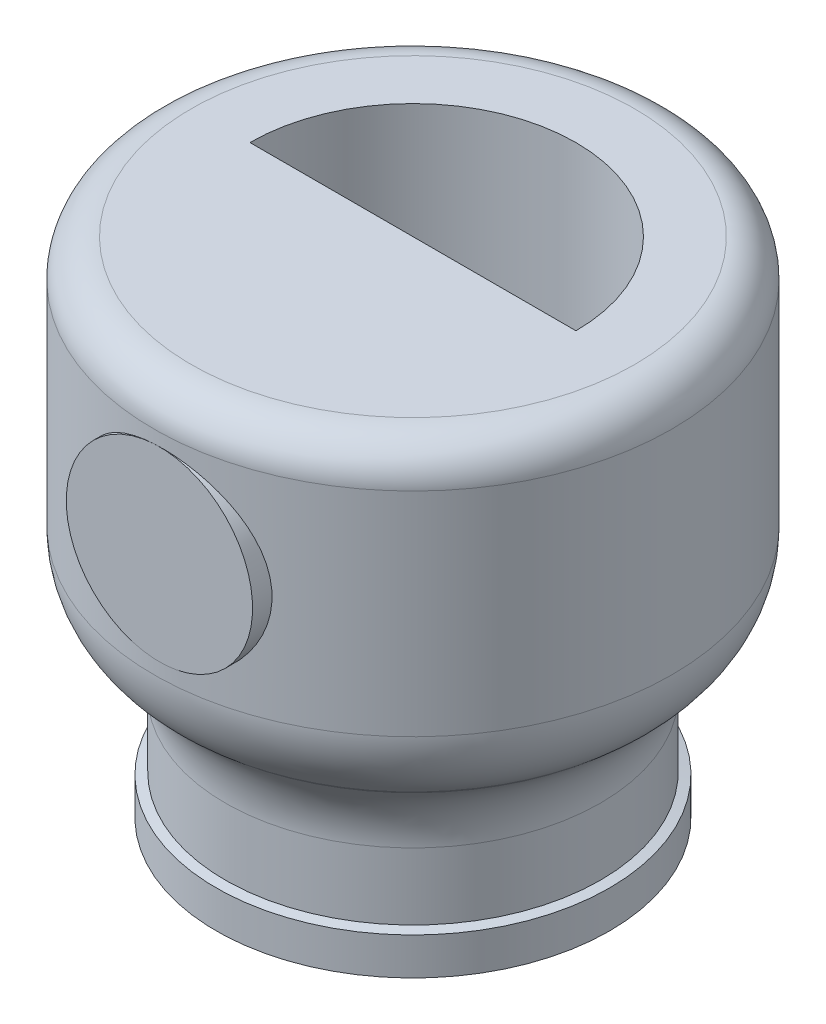
ISO-10303-21;
HEADER;
FILE_DESCRIPTION(('STEP AP214'),'2;1');
FILE_NAME('part.step','',(''),(''),'','','');
FILE_SCHEMA(('AUTOMOTIVE_DESIGN { 1 0 10303 214 1 1 1 1 }'));
ENDSEC;
DATA;
#1=APPLICATION_CONTEXT('core data for automotive mechanical design processes');
#2=APPLICATION_PROTOCOL_DEFINITION('international standard','automotive_design',2000,#1);
#3=PRODUCT_CONTEXT('',#1,'mechanical');
#4=PRODUCT('Part','Part','',(#3));
#5=PRODUCT_RELATED_PRODUCT_CATEGORY('part','',(#4));
#6=PRODUCT_DEFINITION_FORMATION('','',#4);
#7=PRODUCT_DEFINITION_CONTEXT('part definition',#1,'design');
#8=PRODUCT_DEFINITION('design','',#6,#7);
#9=PRODUCT_DEFINITION_SHAPE('','',#8);
#10=(LENGTH_UNIT() NAMED_UNIT(*) SI_UNIT(.MILLI.,.METRE.));
#11=(NAMED_UNIT(*) PLANE_ANGLE_UNIT() SI_UNIT($,.RADIAN.));
#12=(NAMED_UNIT(*) SI_UNIT($,.STERADIAN.) SOLID_ANGLE_UNIT());
#13=UNCERTAINTY_MEASURE_WITH_UNIT(LENGTH_MEASURE(1.E-05),#10,'distance_accuracy_value','');
#14=(GEOMETRIC_REPRESENTATION_CONTEXT(3) GLOBAL_UNCERTAINTY_ASSIGNED_CONTEXT((#13)) GLOBAL_UNIT_ASSIGNED_CONTEXT((#10,
#11,#12)) REPRESENTATION_CONTEXT('',''));
#15=CARTESIAN_POINT('',(0.,0.,0.));
#16=DIRECTION('',(0.,0.,1.));
#17=DIRECTION('',(1.,0.,0.));
#18=AXIS2_PLACEMENT_3D('',#15,#16,#17);
#19=CARTESIAN_POINT('',(26.5604444311898,54.,0.));
#20=DIRECTION('',(0.,1.,0.));
#21=DIRECTION('',(-1.,0.,0.));
#22=AXIS2_PLACEMENT_3D('',#19,#20,#21);
#23=PLANE('',#22);
#24=CARTESIAN_POINT('',(2.76491495539482,54.,0.));
#25=DIRECTION('',(0.,-1.,0.));
#26=DIRECTION('',(1.,0.,0.));
#27=AXIS2_PLACEMENT_3D('',#24,#25,#26);
#28=CIRCLE('',#27,23.795529475795);
#29=CARTESIAN_POINT('',(26.5604444311898,54.,0.));
#30=VERTEX_POINT('',#29);
#31=EDGE_CURVE('E136',#30,#30,#28,.T.);
#32=ORIENTED_EDGE('',*,*,#31,.F.);
#33=EDGE_LOOP('',(#32));
#34=FACE_BOUND('',#33,.T.);
#35=DIRECTION('',(-1.,0.,0.));
#36=VECTOR('',#35,1.);
#37=CARTESIAN_POINT('',(26.5604444311898,54.,0.));
#38=LINE('',#37,#36);
#39=CARTESIAN_POINT('',(20.2649149553948,54.,0.));
#40=VERTEX_POINT('',#39);
#41=CARTESIAN_POINT('',(-14.7350850446052,54.,0.));
#42=VERTEX_POINT('',#41);
#43=EDGE_CURVE('E332',#40,#42,#38,.T.);
#44=ORIENTED_EDGE('',*,*,#43,.T.);
#45=CARTESIAN_POINT('',(2.76491495539482,54.,0.));
#46=DIRECTION('',(0.,1.,0.));
#47=DIRECTION('',(-1.,0.,0.));
#48=AXIS2_PLACEMENT_3D('',#45,#46,#47);
#49=CIRCLE('',#48,17.5);
#50=EDGE_CURVE('E85',#42,#40,#49,.F.);
#51=ORIENTED_EDGE('',*,*,#50,.T.);
#52=EDGE_LOOP('',(#44,#51));
#53=FACE_BOUND('',#52,.T.);
#54=ADVANCED_FACE('F35',(#34,#53),#23,.T.);
#55=CARTESIAN_POINT('',(19.9,15.,0.));
#56=DIRECTION('',(0.,-1.,0.));
#57=DIRECTION('',(1.,0.,0.));
#58=AXIS2_PLACEMENT_3D('',#55,#56,#57);
#59=PLANE('',#58);
#60=CARTESIAN_POINT('',(2.76491495539483,15.,0.));
#61=DIRECTION('',(0.,-1.,0.));
#62=DIRECTION('',(1.,0.,0.));
#63=AXIS2_PLACEMENT_3D('',#60,#61,#62);
#64=CIRCLE('',#63,17.1350850446052);
#65=CARTESIAN_POINT('',(19.9,15.,0.));
#66=VERTEX_POINT('',#65);
#67=CARTESIAN_POINT('',(-14.3701700892103,15.,0.));
#68=VERTEX_POINT('',#67);
#69=EDGE_CURVE('E146',#66,#68,#64,.T.);
#70=ORIENTED_EDGE('',*,*,#69,.T.);
#71=DIRECTION('',(1.,0.,0.));
#72=VECTOR('',#71,1.);
#73=CARTESIAN_POINT('',(19.9,15.,0.));
#74=LINE('',#73,#72);
#75=EDGE_CURVE('E56',#68,#66,#74,.T.);
#76=ORIENTED_EDGE('',*,*,#75,.T.);
#77=EDGE_LOOP('',(#70,#76));
#78=FACE_BOUND('',#77,.T.);
#79=ADVANCED_FACE('F116',(#78),#59,.T.);
#80=CARTESIAN_POINT('',(2.76491495539483,14.,0.));
#81=DIRECTION('',(0.,-1.,0.));
#82=DIRECTION('',(1.,0.,0.));
#83=AXIS2_PLACEMENT_3D('',#80,#81,#82);
#84=TOROIDAL_SURFACE('',#83,17.1350850446052,1.);
#85=CARTESIAN_POINT('',(2.76491495539483,14.,0.));
#86=DIRECTION('',(0.,-1.,0.));
#87=DIRECTION('',(1.,0.,0.));
#88=AXIS2_PLACEMENT_3D('',#85,#86,#87);
#89=CIRCLE('',#88,18.1350850446052);
#90=CARTESIAN_POINT('',(20.9,14.,0.));
#91=VERTEX_POINT('',#90);
#92=EDGE_CURVE('E327',#91,#91,#89,.T.);
#93=ORIENTED_EDGE('',*,*,#92,.T.);
#94=EDGE_LOOP('',(#93));
#95=FACE_BOUND('',#94,.T.);
#96=ORIENTED_EDGE('',*,*,#69,.F.);
#97=CARTESIAN_POINT('',(19.9,14.,0.));
#98=DIRECTION('',(0.,0.,-1.));
#99=DIRECTION('',(-1.,0.,0.));
#100=AXIS2_PLACEMENT_3D('',#97,#98,#99);
#101=CIRCLE('',#100,1.);
#102=CARTESIAN_POINT('',(20.2649149553948,14.9310408558861,0.));
#103=VERTEX_POINT('',#102);
#104=EDGE_CURVE('E11',#66,#103,#101,.T.);
#105=ORIENTED_EDGE('',*,*,#104,.T.);
#106=CARTESIAN_POINT('',(2.76491495539483,14.9310408558861,0.));
#107=DIRECTION('',(0.,-1.,0.));
#108=DIRECTION('',(1.,0.,0.));
#109=AXIS2_PLACEMENT_3D('',#106,#107,#108);
#110=CIRCLE('',#109,17.5);
#111=CARTESIAN_POINT('',(-14.7350850446052,14.9310408558861,0.));
#112=VERTEX_POINT('',#111);
#113=EDGE_CURVE('E43',#103,#112,#110,.F.);
#114=ORIENTED_EDGE('',*,*,#113,.T.);
#115=CARTESIAN_POINT('',(-14.3701700892103,14.,0.));
#116=DIRECTION('',(0.,0.,-1.));
#117=DIRECTION('',(-1.,0.,0.));
#118=AXIS2_PLACEMENT_3D('',#115,#116,#117);
#119=CIRCLE('',#118,1.);
#120=EDGE_CURVE('E72',#112,#68,#119,.T.);
#121=ORIENTED_EDGE('',*,*,#120,.T.);
#122=EDGE_LOOP('',(#96,#105,#114,#121));
#123=FACE_BOUND('',#122,.T.);
#124=ADVANCED_FACE('F89',(#95,#123),#84,.F.);
#125=CARTESIAN_POINT('',(2.76491495539483,7.82182165652493,0.));
#126=DIRECTION('',(0.,-1.,0.));
#127=DIRECTION('',(1.,0.,0.));
#128=AXIS2_PLACEMENT_3D('',#125,#126,#127);
#129=CYLINDRICAL_SURFACE('',#128,18.1350850446052);
#130=CARTESIAN_POINT('',(2.76491495539483,0.,0.));
#131=DIRECTION('',(0.,-1.,0.));
#132=DIRECTION('',(1.,0.,0.));
#133=AXIS2_PLACEMENT_3D('',#130,#131,#132);
#134=CIRCLE('',#133,18.1350850446052);
#135=CARTESIAN_POINT('',(20.9,0.,0.));
#136=VERTEX_POINT('',#135);
#137=EDGE_CURVE('E99',#136,#136,#134,.T.);
#138=ORIENTED_EDGE('',*,*,#137,.T.);
#139=EDGE_LOOP('',(#138));
#140=FACE_BOUND('',#139,.T.);
#141=ORIENTED_EDGE('',*,*,#92,.F.);
#142=EDGE_LOOP('',(#141));
#143=FACE_BOUND('',#142,.T.);
#144=ADVANCED_FACE('F37',(#140,#143),#129,.F.);
#145=CARTESIAN_POINT('',(20.9,0.,0.));
#146=DIRECTION('',(0.,-1.,0.));
#147=DIRECTION('',(1.,0.,0.));
#148=AXIS2_PLACEMENT_3D('',#145,#146,#147);
#149=PLANE('',#148);
#150=CARTESIAN_POINT('',(2.76491495539483,0.,0.));
#151=DIRECTION('',(0.,-1.,0.));
#152=DIRECTION('',(1.,0.,0.));
#153=AXIS2_PLACEMENT_3D('',#150,#151,#152);
#154=CIRCLE('',#153,21.1066768821093);
#155=CARTESIAN_POINT('',(23.8715918375041,0.,0.));
#156=VERTEX_POINT('',#155);
#157=EDGE_CURVE('E163',#156,#156,#154,.T.);
#158=ORIENTED_EDGE('',*,*,#157,.T.);
#159=EDGE_LOOP('',(#158));
#160=FACE_BOUND('',#159,.T.);
#161=ORIENTED_EDGE('',*,*,#137,.F.);
#162=EDGE_LOOP('',(#161));
#163=FACE_BOUND('',#162,.T.);
#164=ADVANCED_FACE('F172',(#160,#163),#149,.T.);
#165=CARTESIAN_POINT('',(2.76491495539483,7.82182165652493,0.));
#166=DIRECTION('',(0.,-1.,0.));
#167=DIRECTION('',(1.,0.,0.));
#168=AXIS2_PLACEMENT_3D('',#165,#166,#167);
#169=CYLINDRICAL_SURFACE('',#168,21.1066768821093);
#170=CARTESIAN_POINT('',(2.76491495539483,4.,0.));
#171=DIRECTION('',(0.,-1.,0.));
#172=DIRECTION('',(1.,0.,0.));
#173=AXIS2_PLACEMENT_3D('',#170,#171,#172);
#174=CIRCLE('',#173,21.1066768821093);
#175=CARTESIAN_POINT('',(23.8715918375041,4.,0.));
#176=VERTEX_POINT('',#175);
#177=EDGE_CURVE('E161',#176,#176,#174,.T.);
#178=ORIENTED_EDGE('',*,*,#177,.T.);
#179=EDGE_LOOP('',(#178));
#180=FACE_BOUND('',#179,.T.);
#181=ORIENTED_EDGE('',*,*,#157,.F.);
#182=EDGE_LOOP('',(#181));
#183=FACE_BOUND('',#182,.T.);
#184=ADVANCED_FACE('F174',(#180,#183),#169,.T.);
#185=CARTESIAN_POINT('',(2.76491495539483,4.,0.));
#186=DIRECTION('',(0.,-1.,0.));
#187=DIRECTION('',(1.,0.,0.));
#188=AXIS2_PLACEMENT_3D('',#185,#186,#187);
#189=CONICAL_SURFACE('',#188,21.1066768821093,1.33186665186768);
#190=CARTESIAN_POINT('',(2.76491495539483,4.23666284308145,0.));
#191=DIRECTION('',(0.,-1.,0.));
#192=DIRECTION('',(1.,0.,0.));
#193=AXIS2_PLACEMENT_3D('',#190,#191,#192);
#194=CIRCLE('',#193,20.1350850446052);
#195=CARTESIAN_POINT('',(22.9,4.23666284308145,0.));
#196=VERTEX_POINT('',#195);
#197=EDGE_CURVE('E158',#196,#196,#194,.T.);
#198=ORIENTED_EDGE('',*,*,#197,.T.);
#199=EDGE_LOOP('',(#198));
#200=FACE_BOUND('',#199,.T.);
#201=ORIENTED_EDGE('',*,*,#177,.F.);
#202=EDGE_LOOP('',(#201));
#203=FACE_BOUND('',#202,.T.);
#204=ADVANCED_FACE('F179',(#200,#203),#189,.T.);
#205=CARTESIAN_POINT('',(2.76491495539483,7.82182165652493,0.));
#206=DIRECTION('',(0.,-1.,0.));
#207=DIRECTION('',(1.,0.,0.));
#208=AXIS2_PLACEMENT_3D('',#205,#206,#207);
#209=CYLINDRICAL_SURFACE('',#208,20.1350850446052);
#210=CARTESIAN_POINT('',(2.76491495539483,11.4043081021399,0.));
#211=DIRECTION('',(0.,-1.,0.));
#212=DIRECTION('',(1.,0.,0.));
#213=AXIS2_PLACEMENT_3D('',#210,#211,#212);
#214=CIRCLE('',#213,20.1350850446052);
#215=CARTESIAN_POINT('',(22.9,11.4043081021399,0.));
#216=VERTEX_POINT('',#215);
#217=EDGE_CURVE('E155',#216,#216,#214,.T.);
#218=ORIENTED_EDGE('',*,*,#217,.T.);
#219=EDGE_LOOP('',(#218));
#220=FACE_BOUND('',#219,.T.);
#221=ORIENTED_EDGE('',*,*,#197,.F.);
#222=EDGE_LOOP('',(#221));
#223=FACE_BOUND('',#222,.T.);
#224=ADVANCED_FACE('F185',(#220,#223),#209,.T.);
#225=CARTESIAN_POINT('',(2.76491495539483,11.40430810214,0.));
#226=DIRECTION('',(0.,-1.,0.));
#227=DIRECTION('',(1.,0.,0.));
#228=AXIS2_PLACEMENT_3D('',#225,#226,#227);
#229=TOROIDAL_SURFACE('',#228,30.1350850446052,10.);
#230=CARTESIAN_POINT('',(2.76491495539483,19.0647525333298,0.));
#231=DIRECTION('',(0.,-1.,0.));
#232=DIRECTION('',(1.,0.,0.));
#233=AXIS2_PLACEMENT_3D('',#230,#231,#232);
#234=CIRCLE('',#233,23.7072089477399);
#235=CARTESIAN_POINT('',(26.4721239031347,19.0647525333298,0.));
#236=VERTEX_POINT('',#235);
#237=EDGE_CURVE('E152',#236,#236,#234,.T.);
#238=ORIENTED_EDGE('',*,*,#237,.T.);
#239=EDGE_LOOP('',(#238));
#240=FACE_BOUND('',#239,.T.);
#241=ORIENTED_EDGE('',*,*,#217,.F.);
#242=EDGE_LOOP('',(#241));
#243=FACE_BOUND('',#242,.T.);
#244=ADVANCED_FACE('F189',(#240,#243),#229,.F.);
#245=CARTESIAN_POINT('',(2.76491495539483,19.0647525333298,0.));
#246=DIRECTION('',(0.,1.,0.));
#247=DIRECTION('',(-1.,0.,0.));
#248=AXIS2_PLACEMENT_3D('',#245,#246,#247);
#249=CONICAL_SURFACE('',#248,23.7072089477399,0.872664625997171);
#250=CARTESIAN_POINT('',(2.76491495539483,19.4978929309155,0.));
#251=DIRECTION('',(0.,-1.,0.));
#252=DIRECTION('',(1.,0.,0.));
#253=AXIS2_PLACEMENT_3D('',#250,#251,#252);
#254=CIRCLE('',#253,24.2234055726603);
#255=CARTESIAN_POINT('',(26.9883205280551,19.4978929309155,0.));
#256=VERTEX_POINT('',#255);
#257=EDGE_CURVE('E144',#256,#256,#254,.T.);
#258=ORIENTED_EDGE('',*,*,#257,.T.);
#259=EDGE_LOOP('',(#258));
#260=FACE_BOUND('',#259,.T.);
#261=ORIENTED_EDGE('',*,*,#237,.F.);
#262=EDGE_LOOP('',(#261));
#263=FACE_BOUND('',#262,.T.);
#264=ADVANCED_FACE('F193',(#260,#263),#249,.T.);
#265=CARTESIAN_POINT('',(2.76491495539483,27.1583373621054,0.));
#266=DIRECTION('',(0.,-1.,0.));
#267=DIRECTION('',(1.,0.,0.));
#268=AXIS2_PLACEMENT_3D('',#265,#266,#267);
#269=TOROIDAL_SURFACE('',#268,17.795529475795,10.);
#270=CARTESIAN_POINT('',(2.76491495539483,27.1583373621054,0.));
#271=DIRECTION('',(0.,-1.,0.));
#272=DIRECTION('',(1.,0.,0.));
#273=AXIS2_PLACEMENT_3D('',#270,#271,#272);
#274=CIRCLE('',#273,27.795529475795);
#275=CARTESIAN_POINT('',(30.5604444311898,27.1583373621054,0.));
#276=VERTEX_POINT('',#275);
#277=EDGE_CURVE('E141',#276,#276,#274,.T.);
#278=ORIENTED_EDGE('',*,*,#277,.T.);
#279=EDGE_LOOP('',(#278));
#280=FACE_BOUND('',#279,.T.);
#281=ORIENTED_EDGE('',*,*,#257,.F.);
#282=EDGE_LOOP('',(#281));
#283=FACE_BOUND('',#282,.T.);
#284=ADVANCED_FACE('F131',(#280,#283),#269,.T.);
#285=CARTESIAN_POINT('',(2.76491495539483,7.82182165652493,0.));
#286=DIRECTION('',(0.,-1.,0.));
#287=DIRECTION('',(1.,0.,0.));
#288=AXIS2_PLACEMENT_3D('',#285,#286,#287);
#289=CYLINDRICAL_SURFACE('',#288,27.795529475795);
#290=CARTESIAN_POINT('',(13.3463458867871,38.6583373621054,25.7026220118486));
#291=CARTESIAN_POINT('',(13.3463467506797,38.9277821022739,25.7026212426184));
#292=CARTESIAN_POINT('',(13.3354465811937,39.1972148635378,25.7071171137235));
#293=CARTESIAN_POINT('',(13.2919687629021,39.7340174371551,25.7249519118154));
#294=CARTESIAN_POINT('',(13.2593923457373,40.0013873658451,25.7382903363697));
#295=CARTESIAN_POINT('',(13.1729081194495,40.5320945802206,25.7733836810905));
#296=CARTESIAN_POINT('',(13.1189995294657,40.79543171792,25.7951389093522));
#297=CARTESIAN_POINT('',(12.9903943982892,41.3162067659098,25.8463887620421));
#298=CARTESIAN_POINT('',(12.9156973821031,41.5736445412607,25.8758835633105));
#299=CARTESIAN_POINT('',(12.7464464105734,42.0802133582729,25.9416402412638));
#300=CARTESIAN_POINT('',(12.651947157288,42.329365136829,25.9778834459237));
#301=CARTESIAN_POINT('',(12.44373220242,42.8186599126973,26.0561762717797));
#302=CARTESIAN_POINT('',(12.330009340582,43.0587995123479,26.0982280554375));
#303=CARTESIAN_POINT('',(12.0842401425005,43.528602925991,26.1869948362899));
#304=CARTESIAN_POINT('',(11.9521936997097,43.7582666790585,26.2337098605997));
#305=CARTESIAN_POINT('',(11.6706780123648,44.2058963523142,26.3306095370754));
#306=CARTESIAN_POINT('',(11.5212074978844,44.4238614181689,26.3807944420297));
#307=CARTESIAN_POINT('',(11.1985025620434,44.8567103541455,26.4857726252769));
#308=CARTESIAN_POINT('',(11.0244902858668,45.0709889713522,26.5406716961283));
#309=CARTESIAN_POINT('',(10.6595087786535,45.4842923905928,26.6515143306982));
#310=CARTESIAN_POINT('',(10.4685391398865,45.683316825634,26.7074579195059));
#311=CARTESIAN_POINT('',(10.0707167754452,46.0650127403382,26.8190118536809));
#312=CARTESIAN_POINT('',(9.86386023069171,46.2476802649348,26.8746221154337));
#313=CARTESIAN_POINT('',(9.43549130510837,46.5954921209992,26.9841386350754));
#314=CARTESIAN_POINT('',(9.21397928881647,46.7606368880596,27.038044935299));
#315=CARTESIAN_POINT('',(8.74863878036111,47.0784128766494,27.1449016086897));
#316=CARTESIAN_POINT('',(8.50427674096215,47.2303042566693,27.1977325815785));
#317=CARTESIAN_POINT('',(8.00273380579803,47.5127627227737,27.2987566692341));
#318=CARTESIAN_POINT('',(7.74555800532649,47.6433381980195,27.3469516054933));
#319=CARTESIAN_POINT('',(7.2200167476639,47.8821093354802,27.4374672990011));
#320=CARTESIAN_POINT('',(6.95165142646173,47.9903052695837,27.4797881276121));
#321=CARTESIAN_POINT('',(6.40564839316566,48.1832779921821,27.5574406379041));
#322=CARTESIAN_POINT('',(6.12801115886875,48.2680559853613,27.5927726790812));
#323=CARTESIAN_POINT('',(5.57638215157694,48.4105135832943,27.6543152072922));
#324=CARTESIAN_POINT('',(5.30266011964647,48.4691091447917,27.6808239838258));
#325=CARTESIAN_POINT('',(4.75062513289938,48.5632043331973,27.7258920994341));
#326=CARTESIAN_POINT('',(4.4723122799301,48.5987044717727,27.7444516146174));
#327=CARTESIAN_POINT('',(3.91333763495258,48.6461887564039,27.7732043831257));
#328=CARTESIAN_POINT('',(3.6326765478635,48.6581797221137,27.7834000621734));
#329=CARTESIAN_POINT('',(3.07116470286908,48.6584918943381,27.7952607055486));
#330=CARTESIAN_POINT('',(2.79031395171638,48.6468139032719,27.7969259590657));
#331=CARTESIAN_POINT('',(2.24491810603403,48.6010682628443,27.7919345123894));
#332=CARTESIAN_POINT('',(1.9802701976664,48.5681695673053,27.7856967619089));
#333=CARTESIAN_POINT('',(1.45472369944559,48.4814067313321,27.7658783501912));
#334=CARTESIAN_POINT('',(1.19382496243998,48.4275434160882,27.7522979779594));
#335=CARTESIAN_POINT('',(0.677577935562517,48.2993135221171,27.7182504886453));
#336=CARTESIAN_POINT('',(0.422229730170447,48.2249466315582,27.6977832668222));
#337=CARTESIAN_POINT('',(-0.0812182002820311,48.0563308589155,27.6505861686878));
#338=CARTESIAN_POINT('',(-0.329317769825685,47.9620815506179,27.6238561581216));
#339=CARTESIAN_POINT('',(-0.818471743992125,47.753692525213,27.5646864705793));
#340=CARTESIAN_POINT('',(-1.05946155178538,47.6394127245774,27.5322065644623));
#341=CARTESIAN_POINT('',(-1.53110602263131,47.3922583555493,27.4625657330638));
#342=CARTESIAN_POINT('',(-1.76175692596454,47.2593770940488,27.4254031233522));
#343=CARTESIAN_POINT('',(-2.21130548967729,46.9759762894753,27.3474083145757));
#344=CARTESIAN_POINT('',(-2.43020277787631,46.8254561883447,27.3065759994182));
#345=CARTESIAN_POINT('',(-2.85503064445834,46.5077508697439,27.2223176301386));
#346=CARTESIAN_POINT('',(-3.06096039890063,46.340564595066,27.1788914115441));
#347=CARTESIAN_POINT('',(-3.46888943397179,45.9815950003482,27.0883184701548));
#348=CARTESIAN_POINT('',(-3.670150520127,45.7889914436546,27.0410950137027));
#349=CARTESIAN_POINT('',(-4.05588736727981,45.3877061868811,26.9463832037301));
#350=CARTESIAN_POINT('',(-4.24036262263078,45.1790240028073,26.8988948422756));
#351=CARTESIAN_POINT('',(-4.5914220414673,44.7467994372934,26.8050143466062));
#352=CARTESIAN_POINT('',(-4.75800206361397,44.5232536353894,26.7586224680701));
#353=CARTESIAN_POINT('',(-5.07212087537345,44.0626976394474,26.6683153425431));
#354=CARTESIAN_POINT('',(-5.2196603768811,43.8256879492801,26.6244000029929));
#355=CARTESIAN_POINT('',(-5.49772859126478,43.3342142456592,26.5394385045658));
#356=CARTESIAN_POINT('',(-5.62780461077978,43.0794788683478,26.4984781635685));
#357=CARTESIAN_POINT('',(-5.86586399421236,42.559232637673,26.4218991371288));
#358=CARTESIAN_POINT('',(-5.97385638830328,42.2937262421033,26.3862782699295));
#359=CARTESIAN_POINT('',(-6.1668392723074,41.7537372736574,26.3215803603233));
#360=CARTESIAN_POINT('',(-6.2518328039325,41.4792558931539,26.2925024526638));
#361=CARTESIAN_POINT('',(-6.39800337069516,40.9233418126132,26.2419203231456));
#362=CARTESIAN_POINT('',(-6.45918167304372,40.6419094832844,26.2204156983175));
#363=CARTESIAN_POINT('',(-6.55494105559617,40.0867471613471,26.1865271745711));
#364=CARTESIAN_POINT('',(-6.59056927192223,39.8132193541774,26.1737851983376));
#365=CARTESIAN_POINT('',(-6.63910912568212,39.2639004168782,26.1563847172211));
#366=CARTESIAN_POINT('',(-6.6520214135389,38.9881093517795,26.1517259808916));
#367=CARTESIAN_POINT('',(-6.65499588625463,38.436440217703,26.1506546773984));
#368=CARTESIAN_POINT('',(-6.64506227006915,38.1605621740297,26.1542405949113));
#369=CARTESIAN_POINT('',(-6.60245672026117,37.6107987661365,26.1695303281976));
#370=CARTESIAN_POINT('',(-6.56978514634915,37.3369133704626,26.1812340155494));
#371=CARTESIAN_POINT('',(-6.48373595936502,36.8037277442479,26.2117512471871));
#372=CARTESIAN_POINT('',(-6.43120768216105,36.5442730018554,26.2302724288113));
#373=CARTESIAN_POINT('',(-6.30589572281171,36.0307712719075,26.2738700992557));
#374=CARTESIAN_POINT('',(-6.23310488253185,35.7767262296359,26.2989489044905));
#375=CARTESIAN_POINT('',(-6.06790705793705,35.2758269101046,26.3548915465073));
#376=CARTESIAN_POINT('',(-5.97550466195667,35.0289709662142,26.3857540299383));
#377=CARTESIAN_POINT('',(-5.77175338960273,34.5437867607262,26.4523767744537));
#378=CARTESIAN_POINT('',(-5.66039717760229,34.3054618442483,26.4881389307914));
#379=CARTESIAN_POINT('',(-5.41581964512394,33.831564001845,26.564712662015));
#380=CARTESIAN_POINT('',(-5.28202751992324,33.5963054174963,26.605646401383));
#381=CARTESIAN_POINT('',(-4.99603821175475,33.1376763735824,26.6904723195448));
#382=CARTESIAN_POINT('',(-4.84383279563464,32.9143112967348,26.734365817827));
#383=CARTESIAN_POINT('',(-4.52202772496277,32.4808325603602,26.8238664339569));
#384=CARTESIAN_POINT('',(-4.35242713478869,32.270719614599,26.8694736438951));
#385=CARTESIAN_POINT('',(-3.99685318796656,31.864943181332,26.9611508600873));
#386=CARTESIAN_POINT('',(-3.81087945517322,31.6692800259756,27.007220876952));
#387=CARTESIAN_POINT('',(-3.41386155361355,31.2840646941256,27.1008825380269));
#388=CARTESIAN_POINT('',(-3.20202640665692,31.0953168380638,27.1484339302512));
#389=CARTESIAN_POINT('',(-2.76286436248656,30.7363456425542,27.2412455306916));
#390=CARTESIAN_POINT('',(-2.53554312242131,30.5661155968439,27.2865065651682));
#391=CARTESIAN_POINT('',(-2.06667271203996,30.2452550666619,27.3734191976298));
#392=CARTESIAN_POINT('',(-1.82511812373015,30.0946321166597,27.4150694060318));
#393=CARTESIAN_POINT('',(-1.32953585786986,29.8142919890175,27.4934506514793));
#394=CARTESIAN_POINT('',(-1.07551358642064,29.6845658530069,27.5301837953007));
#395=CARTESIAN_POINT('',(-0.558963445896263,29.4480975901194,27.5972916324096));
#396=CARTESIAN_POINT('',(-0.296532196118554,29.3411599161002,27.6277203553277));
#397=CARTESIAN_POINT('',(0.237105421191776,29.1497639570286,27.681646347434));
#398=CARTESIAN_POINT('',(0.508311784862325,29.0653056620829,27.7051436196728));
#399=CARTESIAN_POINT('',(1.05736622775294,28.9196922101092,27.7443950186722));
#400=CARTESIAN_POINT('',(1.33521203382265,28.8585291955788,27.760151756837));
#401=CARTESIAN_POINT('',(1.89543988383297,28.7600674488549,27.7833412546476));
#402=CARTESIAN_POINT('',(2.17782171303057,28.7227675903324,27.7907744071749));
#403=CARTESIAN_POINT('',(2.73014021528458,28.6736923897316,27.7968081006747));
#404=CARTESIAN_POINT('',(2.99996433279007,28.6606955856305,27.7958459939314));
#405=CARTESIAN_POINT('',(3.53963003763627,28.6565651175248,27.7860414433971));
#406=CARTESIAN_POINT('',(3.8094716239489,28.6654306374236,27.7771992937672));
#407=CARTESIAN_POINT('',(4.34716757247668,28.7048945975942,27.7517634945061));
#408=CARTESIAN_POINT('',(4.61502208219522,28.7354914080766,27.7351704262052));
#409=CARTESIAN_POINT('',(5.14683840460148,28.8180812466258,27.6945666520365));
#410=CARTESIAN_POINT('',(5.41080019683061,28.870074387102,27.6705559071988));
#411=CARTESIAN_POINT('',(5.92904610024611,28.9939919992937,27.6160569422403));
#412=CARTESIAN_POINT('',(6.18341619783529,29.0656031552389,27.5856721734139));
#413=CARTESIAN_POINT('',(6.68506895537541,29.2284645935136,27.5188646144497));
#414=CARTESIAN_POINT('',(6.93234905101865,29.3197218823934,27.4824396712259));
#415=CARTESIAN_POINT('',(7.41818360014348,29.5210909377065,27.4043623721521));
#416=CARTESIAN_POINT('',(7.65673988387677,29.6311987214527,27.3627111209994));
#417=CARTESIAN_POINT('',(8.12391548923101,29.869502337868,27.2750634742108));
#418=CARTESIAN_POINT('',(8.35253092803971,29.9977051567529,27.2290654026116));
#419=CARTESIAN_POINT('',(8.80852283960875,30.2774457183902,27.1315873881407));
#420=CARTESIAN_POINT('',(9.03538233947552,30.4297729865935,27.079954013771));
#421=CARTESIAN_POINT('',(9.47561863541725,30.7522319968814,26.9742320700564));
#422=CARTESIAN_POINT('',(9.68898924827505,30.9223718105583,26.9201423940019));
#423=CARTESIAN_POINT('',(10.1009819192527,31.2793675026282,26.8108003364131));
#424=CARTESIAN_POINT('',(10.2996021560979,31.4662254390003,26.7555478123759));
#425=CARTESIAN_POINT('',(10.6809508336662,31.8555565786895,26.6452105314894));
#426=CARTESIAN_POINT('',(10.8636790200245,32.0580300318472,26.5901257773391));
#427=CARTESIAN_POINT('',(11.2206302863772,32.4876508411687,26.4788399761401));
#428=CARTESIAN_POINT('',(11.394011161067,32.7155185914245,26.4227143435104));
#429=CARTESIAN_POINT('',(11.7208572308537,33.1857229334844,26.3137271080731));
#430=CARTESIAN_POINT('',(11.8743299975217,33.4280539730205,26.2608642683739));
#431=CARTESIAN_POINT('',(12.1603208389707,33.9258673231902,26.1599086931028));
#432=CARTESIAN_POINT('',(12.2928309519575,34.1813545820673,26.1118177725189));
#433=CARTESIAN_POINT('',(12.5356343745004,34.7036110828207,26.0219381487292));
#434=CARTESIAN_POINT('',(12.6459377702971,34.9703751358822,25.9801465865465));
#435=CARTESIAN_POINT('',(12.8433877754872,35.5135432745424,25.9041898684053));
#436=CARTESIAN_POINT('',(12.9305241387967,35.789951564566,25.8700280879356));
#437=CARTESIAN_POINT('',(13.0806448742074,36.3501956411642,25.8105348341637));
#438=CARTESIAN_POINT('',(13.143629103182,36.6340314717442,25.7852034131907));
#439=CARTESIAN_POINT('',(13.2446847730938,37.2066584983713,25.7442976712579));
#440=CARTESIAN_POINT('',(13.2827686278462,37.4954471514337,25.7287184885891));
#441=CARTESIAN_POINT('',(13.3335977957686,38.0756077855596,25.7078814502822));
#442=CARTESIAN_POINT('',(13.346344952637,38.3669795771037,25.7026228436376));
#443=CARTESIAN_POINT('',(13.3463458867871,38.6583373621054,25.7026220118486));
#444=B_SPLINE_CURVE_WITH_KNOTS('',3,(#290,#291,#292,#293,#294,#295,#296,#297,#298,#299,#300,
#301,#302,#303,#304,#305,#306,#307,#308,#309,#310,#311,#312,#313,#314,#315,#316,#317,#318,#319,
#320,#321,#322,#323,#324,#325,#326,#327,#328,#329,#330,#331,#332,#333,#334,#335,#336,#337,#338,
#339,#340,#341,#342,#343,#344,#345,#346,#347,#348,#349,#350,#351,#352,#353,#354,#355,#356,#357,
#358,#359,#360,#361,#362,#363,#364,#365,#366,#367,#368,#369,#370,#371,#372,#373,#374,#375,#376,
#377,#378,#379,#380,#381,#382,#383,#384,#385,#386,#387,#388,#389,#390,#391,#392,#393,#394,#395,
#396,#397,#398,#399,#400,#401,#402,#403,#404,#405,#406,#407,#408,#409,#410,#411,#412,#413,#414,
#415,#416,#417,#418,#419,#420,#421,#422,#423,#424,#425,#426,#427,#428,#429,#430,#431,#432,#433,
#434,#435,#436,#437,#438,#439,#440,#441,#442,#443),.UNSPECIFIED.,.T.,.F.,(4,2,2,2,2,2,2,2,2,2,2,
2,2,2,2,2,2,2,2,2,2,2,2,2,2,2,2,2,2,2,2,2,2,2,2,2,2,2,2,2,2,2,2,2,2,2,2,2,2,2,2,2,2,2,2,2,2,2,2,
2,2,2,2,2,2,2,2,2,2,2,2,2,2,2,2,2,4),(0.,0.808057267816626,1.61606862586876,2.42410956378593,
3.23216896609579,4.03802492206399,4.84418170086265,5.65034316747197,6.45656342668973,
7.29995003129204,8.14335692014369,8.98696719539949,9.83055649470299,10.7070666362457,
11.5832309794046,12.4593846774343,13.3354932952741,14.1779427925391,15.0203736251361,
15.8625600451619,16.7047179140628,17.5040433523017,18.3033373313968,19.1026434673403,
19.9019667395222,20.7071210172973,21.5125657509117,22.318035974067,23.1235573242502,
23.9702286044995,24.8169253809448,25.6638176808941,26.5106783077056,27.3764233110585,
28.2418135932405,29.1070893673299,29.972319093704,30.7996703059205,31.6269978282852,
32.4541733044068,33.2813356950554,34.0765196457537,34.8719848675378,35.6672641864203,
36.4628520021808,37.2831030231985,38.1037221688819,38.9243854758148,39.7450676410223,
40.6070903069241,41.4687997429028,42.3308393387977,43.1925083929845,44.0464558479673,
44.900402927119,45.7540617141408,46.6076802059269,47.4171058287024,48.2265012369672,
49.0358359491252,49.8451749133136,50.6422741257852,51.4396580861568,52.236873784605,
53.0343981220641,53.8677478695687,54.7014768899097,55.5353086827934,56.3691538193559,
57.2434367976375,58.117386282314,58.9916669076093,59.8655495362763,60.7398180165261,
61.6140916776499,62.4879291459793,63.3617030246541),.UNSPECIFIED.);
#445=CARTESIAN_POINT('',(2.76491495539483,48.6414199557745,27.795529475795));
#446=VERTEX_POINT('',#445);
#447=CARTESIAN_POINT('',(2.76491495539483,28.6752547684362,27.795529475795));
#448=VERTEX_POINT('',#447);
#449=EDGE_CURVE('E79',#446,#448,#444,.T.);
#450=ORIENTED_EDGE('',*,*,#449,.F.);
#451=EDGE_CURVE('E91',#448,#446,#444,.T.);
#452=ORIENTED_EDGE('',*,*,#451,.F.);
#453=EDGE_LOOP('',(#450,#452));
#454=FACE_BOUND('',#453,.T.);
#455=CARTESIAN_POINT('',(2.76491495539482,50.,0.));
#456=DIRECTION('',(0.,-1.,0.));
#457=DIRECTION('',(1.,0.,0.));
#458=AXIS2_PLACEMENT_3D('',#455,#456,#457);
#459=CIRCLE('',#458,27.795529475795);
#460=CARTESIAN_POINT('',(30.5604444311898,50.,0.));
#461=VERTEX_POINT('',#460);
#462=EDGE_CURVE('E139',#461,#461,#459,.T.);
#463=ORIENTED_EDGE('',*,*,#462,.T.);
#464=EDGE_LOOP('',(#463));
#465=FACE_BOUND('',#464,.T.);
#466=ORIENTED_EDGE('',*,*,#277,.F.);
#467=EDGE_LOOP('',(#466));
#468=FACE_BOUND('',#467,.T.);
#469=ADVANCED_FACE('F101',(#454,#465,#468),#289,.T.);
#470=CARTESIAN_POINT('',(2.76491495539482,50.,0.));
#471=DIRECTION('',(0.,-1.,0.));
#472=DIRECTION('',(1.,0.,0.));
#473=AXIS2_PLACEMENT_3D('',#470,#471,#472);
#474=TOROIDAL_SURFACE('',#473,23.795529475795,4.);
#475=ORIENTED_EDGE('',*,*,#31,.T.);
#476=EDGE_LOOP('',(#475));
#477=FACE_BOUND('',#476,.T.);
#478=ORIENTED_EDGE('',*,*,#462,.F.);
#479=EDGE_LOOP('',(#478));
#480=FACE_BOUND('',#479,.T.);
#481=ADVANCED_FACE('F123',(#477,#480),#474,.T.);
#482=CARTESIAN_POINT('',(3.3463458867871,38.6583373621054,22.795529475795));
#483=DIRECTION('',(0.,0.,1.));
#484=DIRECTION('',(1.,0.,0.));
#485=AXIS2_PLACEMENT_3D('',#482,#483,#484);
#486=CYLINDRICAL_SURFACE('',#485,10.);
#487=CARTESIAN_POINT('',(3.3463458867871,38.6583373621054,27.795529475795));
#488=DIRECTION('',(0.,0.,1.));
#489=DIRECTION('',(1.,0.,0.));
#490=AXIS2_PLACEMENT_3D('',#487,#488,#489);
#491=CIRCLE('',#490,10.);
#492=EDGE_CURVE('E324',#446,#448,#491,.T.);
#493=ORIENTED_EDGE('',*,*,#492,.F.);
#494=ORIENTED_EDGE('',*,*,#449,.T.);
#495=EDGE_LOOP('',(#493,#494));
#496=FACE_BOUND('',#495,.T.);
#497=ADVANCED_FACE('F112',(#496),#486,.T.);
#498=CARTESIAN_POINT('',(3.3463458867871,38.6583373621054,27.795529475795));
#499=DIRECTION('',(0.,0.,1.));
#500=DIRECTION('',(1.,0.,0.));
#501=AXIS2_PLACEMENT_3D('',#498,#499,#500);
#502=PLANE('',#501);
#503=EDGE_CURVE('E322',#448,#446,#491,.T.);
#504=ORIENTED_EDGE('',*,*,#503,.T.);
#505=ORIENTED_EDGE('',*,*,#492,.T.);
#506=EDGE_LOOP('',(#504,#505));
#507=FACE_BOUND('',#506,.T.);
#508=ADVANCED_FACE('F110',(#507),#502,.T.);
#509=ORIENTED_EDGE('',*,*,#503,.F.);
#510=ORIENTED_EDGE('',*,*,#451,.T.);
#511=EDGE_LOOP('',(#509,#510));
#512=FACE_BOUND('',#511,.T.);
#513=ADVANCED_FACE('F105',(#512),#486,.T.);
#514=CARTESIAN_POINT('',(2.76491495539482,62.,0.));
#515=DIRECTION('',(0.,-1.,0.));
#516=DIRECTION('',(1.,0.,0.));
#517=AXIS2_PLACEMENT_3D('',#514,#515,#516);
#518=CYLINDRICAL_SURFACE('',#517,17.5);
#519=DIRECTION('',(0.,-1.,0.));
#520=VECTOR('',#519,1.);
#521=CARTESIAN_POINT('',(-14.7350850446052,62.,0.));
#522=LINE('',#521,#520);
#523=EDGE_CURVE('E50',#42,#112,#522,.T.);
#524=ORIENTED_EDGE('',*,*,#523,.T.);
#525=ORIENTED_EDGE('',*,*,#113,.F.);
#526=DIRECTION('',(0.,-1.,0.));
#527=VECTOR('',#526,1.);
#528=CARTESIAN_POINT('',(20.2649149553948,62.,0.));
#529=LINE('',#528,#527);
#530=EDGE_CURVE('E87',#40,#103,#529,.T.);
#531=ORIENTED_EDGE('',*,*,#530,.F.);
#532=ORIENTED_EDGE('',*,*,#50,.F.);
#533=EDGE_LOOP('',(#524,#525,#531,#532));
#534=FACE_BOUND('',#533,.T.);
#535=ADVANCED_FACE('F82',(#534),#518,.F.);
#536=CARTESIAN_POINT('',(-14.7350850446052,62.,0.));
#537=DIRECTION('',(0.,0.,-1.));
#538=DIRECTION('',(-1.,0.,0.));
#539=AXIS2_PLACEMENT_3D('',#536,#537,#538);
#540=PLANE('',#539);
#541=ORIENTED_EDGE('',*,*,#530,.T.);
#542=ORIENTED_EDGE('',*,*,#104,.F.);
#543=ORIENTED_EDGE('',*,*,#75,.F.);
#544=ORIENTED_EDGE('',*,*,#120,.F.);
#545=ORIENTED_EDGE('',*,*,#523,.F.);
#546=ORIENTED_EDGE('',*,*,#43,.F.);
#547=EDGE_LOOP('',(#541,#542,#543,#544,#545,#546));
#548=FACE_BOUND('',#547,.T.);
#549=ADVANCED_FACE('F74',(#548),#540,.T.);
#550=CLOSED_SHELL('',(#54,#79,#124,#144,#164,#184,#204,#224,#244,#264,#284,#469,#481,#497,#508,
#513,#535,#549));
#551=MANIFOLD_SOLID_BREP('B2',#550);
#552=ADVANCED_BREP_SHAPE_REPRESENTATION('',(#18,#551),#14);
#553=SHAPE_DEFINITION_REPRESENTATION(#9,#552);
ENDSEC;
END-ISO-10303-21;
